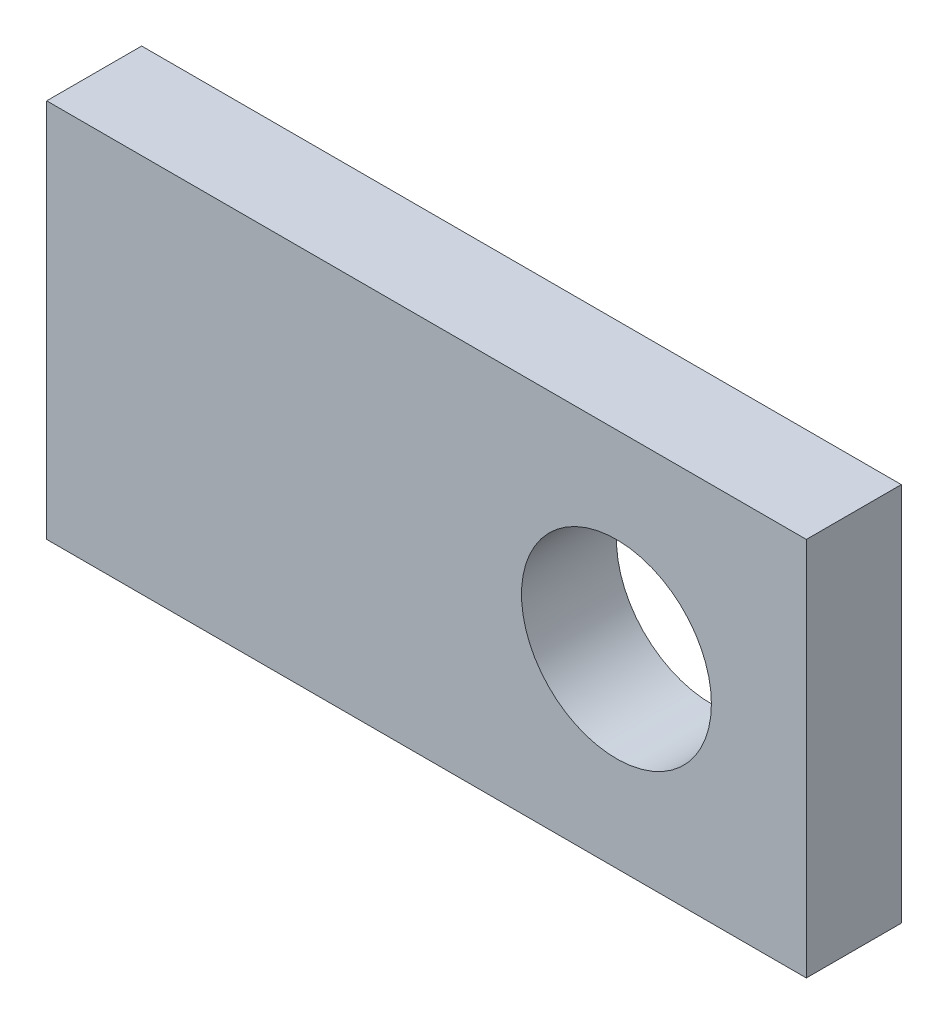
ISO-10303-21;
HEADER;
FILE_DESCRIPTION(('STEP AP214'),'2;1');
FILE_NAME('part.step','',(''),(''),'','','');
FILE_SCHEMA(('AUTOMOTIVE_DESIGN { 1 0 10303 214 1 1 1 1 }'));
ENDSEC;
DATA;
#1=APPLICATION_CONTEXT('core data for automotive mechanical design processes');
#2=APPLICATION_PROTOCOL_DEFINITION('international standard','automotive_design',2000,#1);
#3=PRODUCT_CONTEXT('',#1,'mechanical');
#4=PRODUCT('Part','Part','',(#3));
#5=PRODUCT_RELATED_PRODUCT_CATEGORY('part','',(#4));
#6=PRODUCT_DEFINITION_FORMATION('','',#4);
#7=PRODUCT_DEFINITION_CONTEXT('part definition',#1,'design');
#8=PRODUCT_DEFINITION('design','',#6,#7);
#9=PRODUCT_DEFINITION_SHAPE('','',#8);
#10=(LENGTH_UNIT() NAMED_UNIT(*) SI_UNIT(.MILLI.,.METRE.));
#11=(NAMED_UNIT(*) PLANE_ANGLE_UNIT() SI_UNIT($,.RADIAN.));
#12=(NAMED_UNIT(*) SI_UNIT($,.STERADIAN.) SOLID_ANGLE_UNIT());
#13=UNCERTAINTY_MEASURE_WITH_UNIT(LENGTH_MEASURE(1.E-05),#10,'distance_accuracy_value','');
#14=(GEOMETRIC_REPRESENTATION_CONTEXT(3) GLOBAL_UNCERTAINTY_ASSIGNED_CONTEXT((#13)) GLOBAL_UNIT_ASSIGNED_CONTEXT((#10,
#11,#12)) REPRESENTATION_CONTEXT('',''));
#15=CARTESIAN_POINT('',(0.,0.,0.));
#16=DIRECTION('',(0.,0.,1.));
#17=DIRECTION('',(1.,0.,0.));
#18=AXIS2_PLACEMENT_3D('',#15,#16,#17);
#19=CARTESIAN_POINT('',(0.,0.,6.35));
#20=DIRECTION('',(0.,0.,-1.));
#21=DIRECTION('',(-1.,0.,0.));
#22=AXIS2_PLACEMENT_3D('',#19,#20,#21);
#23=PLANE('',#22);
#24=DIRECTION('',(0.,-1.,0.));
#25=VECTOR('',#24,1.);
#26=CARTESIAN_POINT('',(0.,0.,6.35));
#27=LINE('',#26,#25);
#28=CARTESIAN_POINT('',(0.,25.4,6.35));
#29=VERTEX_POINT('',#28);
#30=CARTESIAN_POINT('',(0.,0.,6.35));
#31=VERTEX_POINT('',#30);
#32=EDGE_CURVE('E85',#29,#31,#27,.T.);
#33=ORIENTED_EDGE('',*,*,#32,.T.);
#34=DIRECTION('',(1.,0.,0.));
#35=VECTOR('',#34,1.);
#36=CARTESIAN_POINT('',(0.,0.,6.35));
#37=LINE('',#36,#35);
#38=CARTESIAN_POINT('',(50.8,0.,6.35));
#39=VERTEX_POINT('',#38);
#40=EDGE_CURVE('E80',#31,#39,#37,.T.);
#41=ORIENTED_EDGE('',*,*,#40,.T.);
#42=DIRECTION('',(0.,1.,0.));
#43=VECTOR('',#42,1.);
#44=CARTESIAN_POINT('',(50.8,0.,6.35));
#45=LINE('',#44,#43);
#46=CARTESIAN_POINT('',(50.8,25.4,6.35));
#47=VERTEX_POINT('',#46);
#48=EDGE_CURVE('E83',#39,#47,#45,.T.);
#49=ORIENTED_EDGE('',*,*,#48,.T.);
#50=DIRECTION('',(-1.,0.,0.));
#51=VECTOR('',#50,1.);
#52=CARTESIAN_POINT('',(0.,25.4,6.35));
#53=LINE('',#52,#51);
#54=EDGE_CURVE('E50',#47,#29,#53,.T.);
#55=ORIENTED_EDGE('',*,*,#54,.T.);
#56=EDGE_LOOP('',(#33,#41,#49,#55));
#57=FACE_BOUND('',#56,.T.);
#58=CARTESIAN_POINT('',(38.1,12.7,6.35));
#59=DIRECTION('',(0.,0.,1.));
#60=DIRECTION('',(1.,0.,0.));
#61=AXIS2_PLACEMENT_3D('',#58,#59,#60);
#62=CIRCLE('',#61,6.35);
#63=CARTESIAN_POINT('',(44.45,12.7,6.35));
#64=VERTEX_POINT('',#63);
#65=EDGE_CURVE('E100',#64,#64,#62,.T.);
#66=ORIENTED_EDGE('',*,*,#65,.F.);
#67=EDGE_LOOP('',(#66));
#68=FACE_BOUND('',#67,.T.);
#69=ADVANCED_FACE('F33',(#57,#68),#23,.F.);
#70=CARTESIAN_POINT('',(0.,0.,0.));
#71=DIRECTION('',(0.,0.,-1.));
#72=DIRECTION('',(-1.,0.,0.));
#73=AXIS2_PLACEMENT_3D('',#70,#71,#72);
#74=PLANE('',#73);
#75=DIRECTION('',(0.,-1.,0.));
#76=VECTOR('',#75,1.);
#77=CARTESIAN_POINT('',(0.,0.,0.));
#78=LINE('',#77,#76);
#79=CARTESIAN_POINT('',(0.,25.4,0.));
#80=VERTEX_POINT('',#79);
#81=CARTESIAN_POINT('',(0.,0.,0.));
#82=VERTEX_POINT('',#81);
#83=EDGE_CURVE('E97',#80,#82,#78,.T.);
#84=ORIENTED_EDGE('',*,*,#83,.F.);
#85=DIRECTION('',(-1.,0.,0.));
#86=VECTOR('',#85,1.);
#87=CARTESIAN_POINT('',(0.,25.4,0.));
#88=LINE('',#87,#86);
#89=CARTESIAN_POINT('',(50.8,25.4,0.));
#90=VERTEX_POINT('',#89);
#91=EDGE_CURVE('E73',#90,#80,#88,.T.);
#92=ORIENTED_EDGE('',*,*,#91,.F.);
#93=DIRECTION('',(0.,1.,0.));
#94=VECTOR('',#93,1.);
#95=CARTESIAN_POINT('',(50.8,0.,0.));
#96=LINE('',#95,#94);
#97=CARTESIAN_POINT('',(50.8,0.,0.));
#98=VERTEX_POINT('',#97);
#99=EDGE_CURVE('E67',#98,#90,#96,.T.);
#100=ORIENTED_EDGE('',*,*,#99,.F.);
#101=DIRECTION('',(1.,0.,0.));
#102=VECTOR('',#101,1.);
#103=CARTESIAN_POINT('',(0.,0.,0.));
#104=LINE('',#103,#102);
#105=EDGE_CURVE('E89',#82,#98,#104,.T.);
#106=ORIENTED_EDGE('',*,*,#105,.F.);
#107=EDGE_LOOP('',(#84,#92,#100,#106));
#108=FACE_BOUND('',#107,.T.);
#109=CARTESIAN_POINT('',(38.1,12.7,0.));
#110=DIRECTION('',(0.,0.,1.));
#111=DIRECTION('',(1.,0.,0.));
#112=AXIS2_PLACEMENT_3D('',#109,#110,#111);
#113=CIRCLE('',#112,6.35);
#114=CARTESIAN_POINT('',(44.45,12.7,0.));
#115=VERTEX_POINT('',#114);
#116=EDGE_CURVE('E112',#115,#115,#113,.T.);
#117=ORIENTED_EDGE('',*,*,#116,.T.);
#118=EDGE_LOOP('',(#117));
#119=FACE_BOUND('',#118,.T.);
#120=ADVANCED_FACE('F108',(#108,#119),#74,.T.);
#121=CARTESIAN_POINT('',(0.,0.,6.35));
#122=DIRECTION('',(1.,0.,0.));
#123=DIRECTION('',(0.,0.,-1.));
#124=AXIS2_PLACEMENT_3D('',#121,#122,#123);
#125=PLANE('',#124);
#126=ORIENTED_EDGE('',*,*,#83,.T.);
#127=DIRECTION('',(0.,0.,-1.));
#128=VECTOR('',#127,1.);
#129=CARTESIAN_POINT('',(0.,0.,6.35));
#130=LINE('',#129,#128);
#131=EDGE_CURVE('E11',#31,#82,#130,.T.);
#132=ORIENTED_EDGE('',*,*,#131,.F.);
#133=ORIENTED_EDGE('',*,*,#32,.F.);
#134=DIRECTION('',(0.,0.,-1.));
#135=VECTOR('',#134,1.);
#136=CARTESIAN_POINT('',(0.,25.4,6.35));
#137=LINE('',#136,#135);
#138=EDGE_CURVE('E93',#29,#80,#137,.T.);
#139=ORIENTED_EDGE('',*,*,#138,.T.);
#140=EDGE_LOOP('',(#126,#132,#133,#139));
#141=FACE_BOUND('',#140,.T.);
#142=ADVANCED_FACE('F35',(#141),#125,.F.);
#143=CARTESIAN_POINT('',(0.,0.,6.35));
#144=DIRECTION('',(0.,1.,0.));
#145=DIRECTION('',(0.,0.,1.));
#146=AXIS2_PLACEMENT_3D('',#143,#144,#145);
#147=PLANE('',#146);
#148=ORIENTED_EDGE('',*,*,#105,.T.);
#149=DIRECTION('',(0.,0.,-1.));
#150=VECTOR('',#149,1.);
#151=CARTESIAN_POINT('',(50.8,0.,6.35));
#152=LINE('',#151,#150);
#153=EDGE_CURVE('E42',#39,#98,#152,.T.);
#154=ORIENTED_EDGE('',*,*,#153,.F.);
#155=ORIENTED_EDGE('',*,*,#40,.F.);
#156=ORIENTED_EDGE('',*,*,#131,.T.);
#157=EDGE_LOOP('',(#148,#154,#155,#156));
#158=FACE_BOUND('',#157,.T.);
#159=ADVANCED_FACE('F88',(#158),#147,.F.);
#160=CARTESIAN_POINT('',(50.8,0.,6.35));
#161=DIRECTION('',(-1.,0.,0.));
#162=DIRECTION('',(0.,0.,1.));
#163=AXIS2_PLACEMENT_3D('',#160,#161,#162);
#164=PLANE('',#163);
#165=ORIENTED_EDGE('',*,*,#99,.T.);
#166=DIRECTION('',(0.,0.,-1.));
#167=VECTOR('',#166,1.);
#168=CARTESIAN_POINT('',(50.8,25.4,6.35));
#169=LINE('',#168,#167);
#170=EDGE_CURVE('E90',#47,#90,#169,.T.);
#171=ORIENTED_EDGE('',*,*,#170,.F.);
#172=ORIENTED_EDGE('',*,*,#48,.F.);
#173=ORIENTED_EDGE('',*,*,#153,.T.);
#174=EDGE_LOOP('',(#165,#171,#172,#173));
#175=FACE_BOUND('',#174,.T.);
#176=ADVANCED_FACE('F91',(#175),#164,.F.);
#177=CARTESIAN_POINT('',(0.,25.4,6.35));
#178=DIRECTION('',(0.,-1.,0.));
#179=DIRECTION('',(0.,0.,-1.));
#180=AXIS2_PLACEMENT_3D('',#177,#178,#179);
#181=PLANE('',#180);
#182=ORIENTED_EDGE('',*,*,#91,.T.);
#183=ORIENTED_EDGE('',*,*,#138,.F.);
#184=ORIENTED_EDGE('',*,*,#54,.F.);
#185=ORIENTED_EDGE('',*,*,#170,.T.);
#186=EDGE_LOOP('',(#182,#183,#184,#185));
#187=FACE_BOUND('',#186,.T.);
#188=ADVANCED_FACE('F105',(#187),#181,.F.);
#189=CARTESIAN_POINT('',(38.1,12.7,6.35));
#190=DIRECTION('',(0.,0.,-1.));
#191=DIRECTION('',(-1.,0.,0.));
#192=AXIS2_PLACEMENT_3D('',#189,#190,#191);
#193=CYLINDRICAL_SURFACE('',#192,6.35);
#194=ORIENTED_EDGE('',*,*,#65,.T.);
#195=EDGE_LOOP('',(#194));
#196=FACE_BOUND('',#195,.T.);
#197=ORIENTED_EDGE('',*,*,#116,.F.);
#198=EDGE_LOOP('',(#197));
#199=FACE_BOUND('',#198,.T.);
#200=ADVANCED_FACE('F118',(#196,#199),#193,.F.);
#201=CLOSED_SHELL('',(#69,#120,#142,#159,#176,#188,#200));
#202=MANIFOLD_SOLID_BREP('B2',#201);
#203=ADVANCED_BREP_SHAPE_REPRESENTATION('',(#18,#202),#14);
#204=SHAPE_DEFINITION_REPRESENTATION(#9,#203);
ENDSEC;
END-ISO-10303-21;
